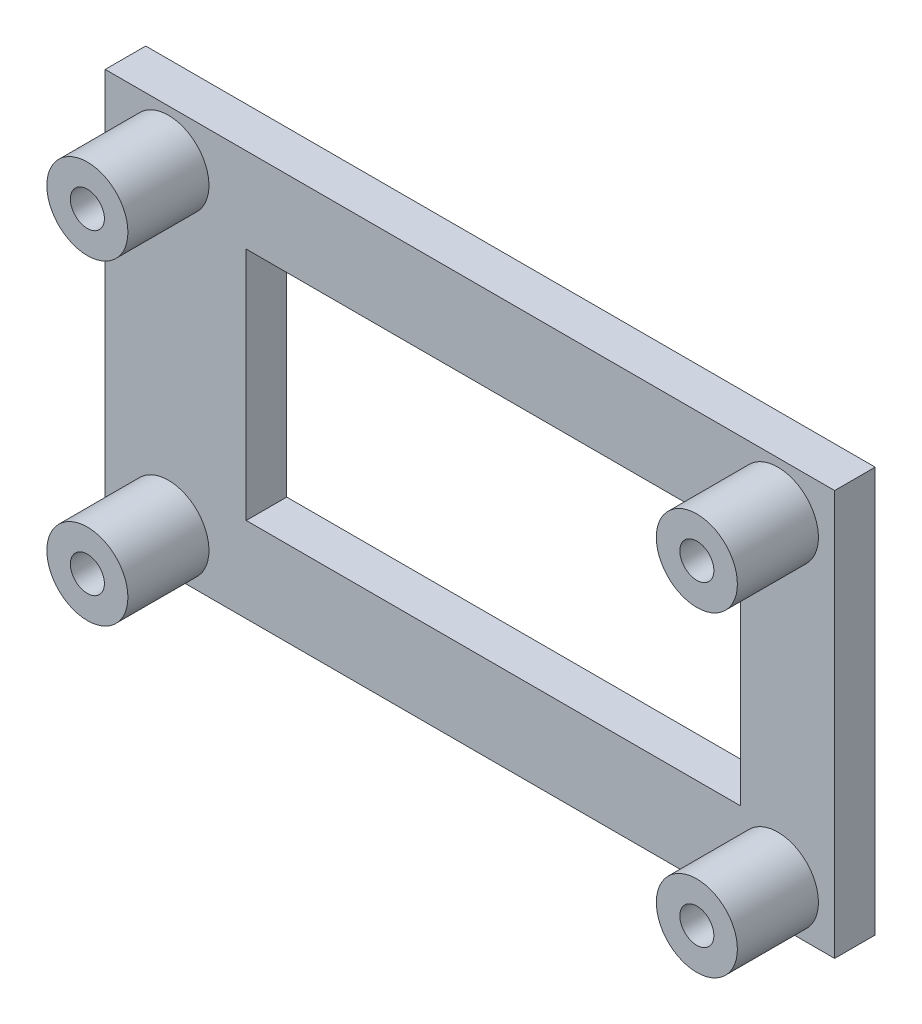
ISO-10303-21;
HEADER;
FILE_DESCRIPTION(('STEP AP214'),'2;1');
FILE_NAME('part.step','',(''),(''),'','','');
FILE_SCHEMA(('AUTOMOTIVE_DESIGN { 1 0 10303 214 1 1 1 1 }'));
ENDSEC;
DATA;
#1=APPLICATION_CONTEXT('core data for automotive mechanical design processes');
#2=APPLICATION_PROTOCOL_DEFINITION('international standard','automotive_design',2000,#1);
#3=PRODUCT_CONTEXT('',#1,'mechanical');
#4=PRODUCT('Part','Part','',(#3));
#5=PRODUCT_RELATED_PRODUCT_CATEGORY('part','',(#4));
#6=PRODUCT_DEFINITION_FORMATION('','',#4);
#7=PRODUCT_DEFINITION_CONTEXT('part definition',#1,'design');
#8=PRODUCT_DEFINITION('design','',#6,#7);
#9=PRODUCT_DEFINITION_SHAPE('','',#8);
#10=(LENGTH_UNIT() NAMED_UNIT(*) SI_UNIT(.MILLI.,.METRE.));
#11=(NAMED_UNIT(*) PLANE_ANGLE_UNIT() SI_UNIT($,.RADIAN.));
#12=(NAMED_UNIT(*) SI_UNIT($,.STERADIAN.) SOLID_ANGLE_UNIT());
#13=UNCERTAINTY_MEASURE_WITH_UNIT(LENGTH_MEASURE(1.E-05),#10,'distance_accuracy_value','');
#14=(GEOMETRIC_REPRESENTATION_CONTEXT(3) GLOBAL_UNCERTAINTY_ASSIGNED_CONTEXT((#13)) GLOBAL_UNIT_ASSIGNED_CONTEXT((#10,
#11,#12)) REPRESENTATION_CONTEXT('',''));
#15=CARTESIAN_POINT('',(0.,0.,0.));
#16=DIRECTION('',(0.,0.,1.));
#17=DIRECTION('',(1.,0.,0.));
#18=AXIS2_PLACEMENT_3D('',#15,#16,#17);
#19=CARTESIAN_POINT('',(0.,0.,-2.5));
#20=DIRECTION('',(1.,0.,0.));
#21=DIRECTION('',(0.,0.,-1.));
#22=AXIS2_PLACEMENT_3D('',#19,#20,#21);
#23=PLANE('',#22);
#24=DIRECTION('',(0.,1.,0.));
#25=VECTOR('',#24,1.);
#26=CARTESIAN_POINT('',(0.,0.,0.));
#27=LINE('',#26,#25);
#28=CARTESIAN_POINT('',(0.,0.,0.));
#29=VERTEX_POINT('',#28);
#30=CARTESIAN_POINT('',(0.,25.,0.));
#31=VERTEX_POINT('',#30);
#32=EDGE_CURVE('E188',#29,#31,#27,.T.);
#33=ORIENTED_EDGE('',*,*,#32,.T.);
#34=DIRECTION('',(0.,0.,1.));
#35=VECTOR('',#34,1.);
#36=CARTESIAN_POINT('',(0.,25.,-2.5));
#37=LINE('',#36,#35);
#38=CARTESIAN_POINT('',(0.,25.,-2.5));
#39=VERTEX_POINT('',#38);
#40=EDGE_CURVE('E219',#39,#31,#37,.T.);
#41=ORIENTED_EDGE('',*,*,#40,.F.);
#42=DIRECTION('',(0.,1.,0.));
#43=VECTOR('',#42,1.);
#44=CARTESIAN_POINT('',(0.,0.,-2.5));
#45=LINE('',#44,#43);
#46=CARTESIAN_POINT('',(0.,0.,-2.5));
#47=VERTEX_POINT('',#46);
#48=EDGE_CURVE('E189',#47,#39,#45,.T.);
#49=ORIENTED_EDGE('',*,*,#48,.F.);
#50=DIRECTION('',(0.,0.,1.));
#51=VECTOR('',#50,1.);
#52=CARTESIAN_POINT('',(0.,0.,-2.5));
#53=LINE('',#52,#51);
#54=EDGE_CURVE('E201',#47,#29,#53,.T.);
#55=ORIENTED_EDGE('',*,*,#54,.T.);
#56=EDGE_LOOP('',(#33,#41,#49,#55));
#57=FACE_BOUND('',#56,.T.);
#58=ADVANCED_FACE('F39',(#57),#23,.F.);
#59=CARTESIAN_POINT('',(0.,25.,-2.5));
#60=DIRECTION('',(0.,-1.,0.));
#61=DIRECTION('',(0.,0.,-1.));
#62=AXIS2_PLACEMENT_3D('',#59,#60,#61);
#63=PLANE('',#62);
#64=DIRECTION('',(1.,0.,0.));
#65=VECTOR('',#64,1.);
#66=CARTESIAN_POINT('',(0.,25.,0.));
#67=LINE('',#66,#65);
#68=CARTESIAN_POINT('',(45.,25.,0.));
#69=VERTEX_POINT('',#68);
#70=EDGE_CURVE('E204',#31,#69,#67,.T.);
#71=ORIENTED_EDGE('',*,*,#70,.T.);
#72=DIRECTION('',(0.,0.,1.));
#73=VECTOR('',#72,1.);
#74=CARTESIAN_POINT('',(45.,25.,-2.5));
#75=LINE('',#74,#73);
#76=CARTESIAN_POINT('',(45.,25.,-2.5));
#77=VERTEX_POINT('',#76);
#78=EDGE_CURVE('E217',#77,#69,#75,.T.);
#79=ORIENTED_EDGE('',*,*,#78,.F.);
#80=DIRECTION('',(1.,0.,0.));
#81=VECTOR('',#80,1.);
#82=CARTESIAN_POINT('',(0.,25.,-2.5));
#83=LINE('',#82,#81);
#84=EDGE_CURVE('E192',#39,#77,#83,.T.);
#85=ORIENTED_EDGE('',*,*,#84,.F.);
#86=ORIENTED_EDGE('',*,*,#40,.T.);
#87=EDGE_LOOP('',(#71,#79,#85,#86));
#88=FACE_BOUND('',#87,.T.);
#89=ADVANCED_FACE('F245',(#88),#63,.F.);
#90=CARTESIAN_POINT('',(45.,0.,-2.5));
#91=DIRECTION('',(1.,0.,0.));
#92=DIRECTION('',(0.,0.,-1.));
#93=AXIS2_PLACEMENT_3D('',#90,#91,#92);
#94=PLANE('',#93);
#95=DIRECTION('',(0.,1.,0.));
#96=VECTOR('',#95,1.);
#97=CARTESIAN_POINT('',(45.,0.,0.));
#98=LINE('',#97,#96);
#99=CARTESIAN_POINT('',(45.,0.,0.));
#100=VERTEX_POINT('',#99);
#101=EDGE_CURVE('E207',#100,#69,#98,.T.);
#102=ORIENTED_EDGE('',*,*,#101,.F.);
#103=DIRECTION('',(0.,0.,1.));
#104=VECTOR('',#103,1.);
#105=CARTESIAN_POINT('',(45.,0.,-2.5));
#106=LINE('',#105,#104);
#107=CARTESIAN_POINT('',(45.,0.,-2.5));
#108=VERTEX_POINT('',#107);
#109=EDGE_CURVE('E214',#108,#100,#106,.T.);
#110=ORIENTED_EDGE('',*,*,#109,.F.);
#111=DIRECTION('',(0.,1.,0.));
#112=VECTOR('',#111,1.);
#113=CARTESIAN_POINT('',(45.,0.,-2.5));
#114=LINE('',#113,#112);
#115=EDGE_CURVE('E195',#108,#77,#114,.T.);
#116=ORIENTED_EDGE('',*,*,#115,.T.);
#117=ORIENTED_EDGE('',*,*,#78,.T.);
#118=EDGE_LOOP('',(#102,#110,#116,#117));
#119=FACE_BOUND('',#118,.T.);
#120=ADVANCED_FACE('F241',(#119),#94,.T.);
#121=CARTESIAN_POINT('',(0.,0.,-2.5));
#122=DIRECTION('',(0.,-1.,0.));
#123=DIRECTION('',(0.,0.,-1.));
#124=AXIS2_PLACEMENT_3D('',#121,#122,#123);
#125=PLANE('',#124);
#126=DIRECTION('',(1.,0.,0.));
#127=VECTOR('',#126,1.);
#128=CARTESIAN_POINT('',(0.,0.,0.));
#129=LINE('',#128,#127);
#130=CARTESIAN_POINT('',(3.9,0.,0.));
#131=VERTEX_POINT('',#130);
#132=EDGE_CURVE('E193',#29,#131,#129,.T.);
#133=ORIENTED_EDGE('',*,*,#132,.F.);
#134=ORIENTED_EDGE('',*,*,#54,.F.);
#135=DIRECTION('',(1.,0.,0.));
#136=VECTOR('',#135,1.);
#137=CARTESIAN_POINT('',(0.,0.,-2.5));
#138=LINE('',#137,#136);
#139=EDGE_CURVE('E198',#47,#108,#138,.T.);
#140=ORIENTED_EDGE('',*,*,#139,.T.);
#141=ORIENTED_EDGE('',*,*,#109,.T.);
#142=CARTESIAN_POINT('',(41.5,0.,0.));
#143=VERTEX_POINT('',#142);
#144=EDGE_CURVE('E210',#143,#100,#129,.T.);
#145=ORIENTED_EDGE('',*,*,#144,.F.);
#146=EDGE_CURVE('E212',#131,#143,#129,.T.);
#147=ORIENTED_EDGE('',*,*,#146,.F.);
#148=EDGE_LOOP('',(#133,#134,#140,#141,#145,#147));
#149=FACE_BOUND('',#148,.T.);
#150=ADVANCED_FACE('F237',(#149),#125,.T.);
#151=CARTESIAN_POINT('',(0.,0.,-2.5));
#152=DIRECTION('',(0.,0.,-1.));
#153=DIRECTION('',(-1.,0.,0.));
#154=AXIS2_PLACEMENT_3D('',#151,#152,#153);
#155=PLANE('',#154);
#156=DIRECTION('',(0.,-1.,0.));
#157=VECTOR('',#156,1.);
#158=CARTESIAN_POINT('',(8.7,19.75,-2.5));
#159=LINE('',#158,#157);
#160=CARTESIAN_POINT('',(8.7,19.75,-2.5));
#161=VERTEX_POINT('',#160);
#162=CARTESIAN_POINT('',(8.7,5.25,-2.5));
#163=VERTEX_POINT('',#162);
#164=EDGE_CURVE('E123',#161,#163,#159,.T.);
#165=ORIENTED_EDGE('',*,*,#164,.T.);
#166=DIRECTION('',(1.,0.,0.));
#167=VECTOR('',#166,1.);
#168=CARTESIAN_POINT('',(8.7,5.25,-2.5));
#169=LINE('',#168,#167);
#170=CARTESIAN_POINT('',(39.2,5.25,-2.5));
#171=VERTEX_POINT('',#170);
#172=EDGE_CURVE('E110',#163,#171,#169,.T.);
#173=ORIENTED_EDGE('',*,*,#172,.T.);
#174=DIRECTION('',(0.,-1.,0.));
#175=VECTOR('',#174,1.);
#176=CARTESIAN_POINT('',(39.2,19.75,-2.5));
#177=LINE('',#176,#175);
#178=CARTESIAN_POINT('',(39.2,19.75,-2.5));
#179=VERTEX_POINT('',#178);
#180=EDGE_CURVE('E140',#179,#171,#177,.T.);
#181=ORIENTED_EDGE('',*,*,#180,.F.);
#182=DIRECTION('',(1.,0.,0.));
#183=VECTOR('',#182,1.);
#184=CARTESIAN_POINT('',(8.7,19.75,-2.5));
#185=LINE('',#184,#183);
#186=EDGE_CURVE('E131',#161,#179,#185,.T.);
#187=ORIENTED_EDGE('',*,*,#186,.F.);
#188=EDGE_LOOP('',(#165,#173,#181,#187));
#189=FACE_BOUND('',#188,.T.);
#190=ORIENTED_EDGE('',*,*,#48,.T.);
#191=ORIENTED_EDGE('',*,*,#84,.T.);
#192=ORIENTED_EDGE('',*,*,#115,.F.);
#193=ORIENTED_EDGE('',*,*,#139,.F.);
#194=EDGE_LOOP('',(#190,#191,#192,#193));
#195=FACE_BOUND('',#194,.T.);
#196=ADVANCED_FACE('F129',(#189,#195),#155,.T.);
#197=CARTESIAN_POINT('',(0.,0.,0.));
#198=DIRECTION('',(0.,0.,-1.));
#199=DIRECTION('',(-1.,0.,0.));
#200=AXIS2_PLACEMENT_3D('',#197,#198,#199);
#201=PLANE('',#200);
#202=DIRECTION('',(1.,0.,0.));
#203=VECTOR('',#202,1.);
#204=CARTESIAN_POINT('',(8.7,5.25,0.));
#205=LINE('',#204,#203);
#206=CARTESIAN_POINT('',(8.7,5.25,0.));
#207=VERTEX_POINT('',#206);
#208=CARTESIAN_POINT('',(39.2,5.25,0.));
#209=VERTEX_POINT('',#208);
#210=EDGE_CURVE('E132',#207,#209,#205,.T.);
#211=ORIENTED_EDGE('',*,*,#210,.F.);
#212=DIRECTION('',(0.,-1.,0.));
#213=VECTOR('',#212,1.);
#214=CARTESIAN_POINT('',(8.7,19.75,0.));
#215=LINE('',#214,#213);
#216=CARTESIAN_POINT('',(8.7,19.75,0.));
#217=VERTEX_POINT('',#216);
#218=EDGE_CURVE('E126',#217,#207,#215,.T.);
#219=ORIENTED_EDGE('',*,*,#218,.F.);
#220=DIRECTION('',(1.,0.,0.));
#221=VECTOR('',#220,1.);
#222=CARTESIAN_POINT('',(8.7,19.75,0.));
#223=LINE('',#222,#221);
#224=CARTESIAN_POINT('',(39.2,19.75,0.));
#225=VERTEX_POINT('',#224);
#226=EDGE_CURVE('E137',#217,#225,#223,.T.);
#227=ORIENTED_EDGE('',*,*,#226,.T.);
#228=DIRECTION('',(0.,-1.,0.));
#229=VECTOR('',#228,1.);
#230=CARTESIAN_POINT('',(39.2,19.75,0.));
#231=LINE('',#230,#229);
#232=EDGE_CURVE('E61',#225,#209,#231,.T.);
#233=ORIENTED_EDGE('',*,*,#232,.T.);
#234=EDGE_LOOP('',(#211,#219,#227,#233));
#235=FACE_BOUND('',#234,.T.);
#236=CARTESIAN_POINT('',(41.5,22.,0.));
#237=DIRECTION('',(0.,0.,-1.));
#238=DIRECTION('',(-1.,0.,0.));
#239=AXIS2_PLACEMENT_3D('',#236,#237,#238);
#240=CIRCLE('',#239,2.5);
#241=CARTESIAN_POINT('',(39.,22.,0.));
#242=VERTEX_POINT('',#241);
#243=EDGE_CURVE('E11',#242,#242,#240,.F.);
#244=ORIENTED_EDGE('',*,*,#243,.F.);
#245=EDGE_LOOP('',(#244));
#246=FACE_BOUND('',#245,.T.);
#247=CARTESIAN_POINT('',(3.9,22.,0.));
#248=DIRECTION('',(0.,0.,-1.));
#249=DIRECTION('',(-1.,0.,0.));
#250=AXIS2_PLACEMENT_3D('',#247,#248,#249);
#251=CIRCLE('',#250,2.5);
#252=CARTESIAN_POINT('',(1.4,22.,0.));
#253=VERTEX_POINT('',#252);
#254=EDGE_CURVE('E46',#253,#253,#251,.F.);
#255=ORIENTED_EDGE('',*,*,#254,.F.);
#256=EDGE_LOOP('',(#255));
#257=FACE_BOUND('',#256,.T.);
#258=ORIENTED_EDGE('',*,*,#146,.T.);
#259=CARTESIAN_POINT('',(41.5,2.5,0.));
#260=DIRECTION('',(0.,0.,1.));
#261=DIRECTION('',(1.,0.,0.));
#262=AXIS2_PLACEMENT_3D('',#259,#260,#261);
#263=CIRCLE('',#262,2.5);
#264=EDGE_CURVE('E173',#143,#143,#263,.T.);
#265=ORIENTED_EDGE('',*,*,#264,.F.);
#266=ORIENTED_EDGE('',*,*,#144,.T.);
#267=ORIENTED_EDGE('',*,*,#101,.T.);
#268=ORIENTED_EDGE('',*,*,#70,.F.);
#269=ORIENTED_EDGE('',*,*,#32,.F.);
#270=ORIENTED_EDGE('',*,*,#132,.T.);
#271=CARTESIAN_POINT('',(3.9,2.5,0.));
#272=DIRECTION('',(0.,0.,1.));
#273=DIRECTION('',(1.,0.,0.));
#274=AXIS2_PLACEMENT_3D('',#271,#272,#273);
#275=CIRCLE('',#274,2.5);
#276=EDGE_CURVE('E177',#131,#131,#275,.T.);
#277=ORIENTED_EDGE('',*,*,#276,.F.);
#278=EDGE_LOOP('',(#258,#265,#266,#267,#268,#269,#270,#277));
#279=FACE_BOUND('',#278,.T.);
#280=ADVANCED_FACE('F226',(#235,#246,#257,#279),#201,.F.);
#281=CARTESIAN_POINT('',(3.9,22.,5.));
#282=DIRECTION('',(0.,0.,-1.));
#283=DIRECTION('',(-1.,0.,0.));
#284=AXIS2_PLACEMENT_3D('',#281,#282,#283);
#285=CYLINDRICAL_SURFACE('',#284,2.5);
#286=CARTESIAN_POINT('',(3.9,22.,5.));
#287=DIRECTION('',(0.,0.,1.));
#288=DIRECTION('',(1.,0.,0.));
#289=AXIS2_PLACEMENT_3D('',#286,#287,#288);
#290=CIRCLE('',#289,2.5);
#291=CARTESIAN_POINT('',(6.4,22.,5.));
#292=VERTEX_POINT('',#291);
#293=EDGE_CURVE('E183',#292,#292,#290,.T.);
#294=ORIENTED_EDGE('',*,*,#293,.F.);
#295=EDGE_LOOP('',(#294));
#296=FACE_BOUND('',#295,.T.);
#297=ORIENTED_EDGE('',*,*,#254,.T.);
#298=EDGE_LOOP('',(#297));
#299=FACE_BOUND('',#298,.T.);
#300=ADVANCED_FACE('F224',(#296,#299),#285,.T.);
#301=CARTESIAN_POINT('',(0.,0.,5.));
#302=DIRECTION('',(0.,0.,1.));
#303=DIRECTION('',(1.,0.,0.));
#304=AXIS2_PLACEMENT_3D('',#301,#302,#303);
#305=PLANE('',#304);
#306=CARTESIAN_POINT('',(3.9,22.,5.));
#307=DIRECTION('',(0.,0.,1.));
#308=DIRECTION('',(1.,0.,0.));
#309=AXIS2_PLACEMENT_3D('',#306,#307,#308);
#310=CIRCLE('',#309,1.05);
#311=CARTESIAN_POINT('',(4.95,22.,5.));
#312=VERTEX_POINT('',#311);
#313=EDGE_CURVE('E156',#312,#312,#310,.T.);
#314=ORIENTED_EDGE('',*,*,#313,.F.);
#315=EDGE_LOOP('',(#314));
#316=FACE_BOUND('',#315,.T.);
#317=ORIENTED_EDGE('',*,*,#293,.T.);
#318=EDGE_LOOP('',(#317));
#319=FACE_BOUND('',#318,.T.);
#320=ADVANCED_FACE('F281',(#316,#319),#305,.T.);
#321=CARTESIAN_POINT('',(3.9,2.5,5.));
#322=DIRECTION('',(0.,0.,-1.));
#323=DIRECTION('',(-1.,0.,0.));
#324=AXIS2_PLACEMENT_3D('',#321,#322,#323);
#325=CYLINDRICAL_SURFACE('',#324,2.5);
#326=CARTESIAN_POINT('',(3.9,2.5,5.));
#327=DIRECTION('',(0.,0.,1.));
#328=DIRECTION('',(1.,0.,0.));
#329=AXIS2_PLACEMENT_3D('',#326,#327,#328);
#330=CIRCLE('',#329,2.5);
#331=CARTESIAN_POINT('',(6.4,2.5,5.));
#332=VERTEX_POINT('',#331);
#333=EDGE_CURVE('E180',#332,#332,#330,.T.);
#334=ORIENTED_EDGE('',*,*,#333,.F.);
#335=EDGE_LOOP('',(#334));
#336=FACE_BOUND('',#335,.T.);
#337=ORIENTED_EDGE('',*,*,#276,.T.);
#338=EDGE_LOOP('',(#337));
#339=FACE_BOUND('',#338,.T.);
#340=ADVANCED_FACE('F289',(#336,#339),#325,.T.);
#341=CARTESIAN_POINT('',(0.,0.,5.));
#342=DIRECTION('',(0.,0.,1.));
#343=DIRECTION('',(1.,0.,0.));
#344=AXIS2_PLACEMENT_3D('',#341,#342,#343);
#345=PLANE('',#344);
#346=CARTESIAN_POINT('',(3.9,2.5,5.));
#347=DIRECTION('',(0.,0.,1.));
#348=DIRECTION('',(1.,0.,0.));
#349=AXIS2_PLACEMENT_3D('',#346,#347,#348);
#350=CIRCLE('',#349,1.05);
#351=CARTESIAN_POINT('',(4.95,2.5,5.));
#352=VERTEX_POINT('',#351);
#353=EDGE_CURVE('E157',#352,#352,#350,.T.);
#354=ORIENTED_EDGE('',*,*,#353,.F.);
#355=EDGE_LOOP('',(#354));
#356=FACE_BOUND('',#355,.T.);
#357=ORIENTED_EDGE('',*,*,#333,.T.);
#358=EDGE_LOOP('',(#357));
#359=FACE_BOUND('',#358,.T.);
#360=ADVANCED_FACE('F294',(#356,#359),#345,.T.);
#361=CARTESIAN_POINT('',(41.5,2.5,5.));
#362=DIRECTION('',(0.,0.,-1.));
#363=DIRECTION('',(-1.,0.,0.));
#364=AXIS2_PLACEMENT_3D('',#361,#362,#363);
#365=CYLINDRICAL_SURFACE('',#364,2.5);
#366=CARTESIAN_POINT('',(41.5,2.5,5.));
#367=DIRECTION('',(0.,0.,1.));
#368=DIRECTION('',(1.,0.,0.));
#369=AXIS2_PLACEMENT_3D('',#366,#367,#368);
#370=CIRCLE('',#369,2.5);
#371=CARTESIAN_POINT('',(44.,2.5,5.));
#372=VERTEX_POINT('',#371);
#373=EDGE_CURVE('E174',#372,#372,#370,.T.);
#374=ORIENTED_EDGE('',*,*,#373,.F.);
#375=EDGE_LOOP('',(#374));
#376=FACE_BOUND('',#375,.T.);
#377=ORIENTED_EDGE('',*,*,#264,.T.);
#378=EDGE_LOOP('',(#377));
#379=FACE_BOUND('',#378,.T.);
#380=ADVANCED_FACE('F302',(#376,#379),#365,.T.);
#381=CARTESIAN_POINT('',(0.,0.,5.));
#382=DIRECTION('',(0.,0.,1.));
#383=DIRECTION('',(1.,0.,0.));
#384=AXIS2_PLACEMENT_3D('',#381,#382,#383);
#385=PLANE('',#384);
#386=CARTESIAN_POINT('',(41.5,2.5,5.));
#387=DIRECTION('',(0.,0.,1.));
#388=DIRECTION('',(1.,0.,0.));
#389=AXIS2_PLACEMENT_3D('',#386,#387,#388);
#390=CIRCLE('',#389,1.05);
#391=CARTESIAN_POINT('',(42.55,2.5,5.));
#392=VERTEX_POINT('',#391);
#393=EDGE_CURVE('E150',#392,#392,#390,.T.);
#394=ORIENTED_EDGE('',*,*,#393,.F.);
#395=EDGE_LOOP('',(#394));
#396=FACE_BOUND('',#395,.T.);
#397=ORIENTED_EDGE('',*,*,#373,.T.);
#398=EDGE_LOOP('',(#397));
#399=FACE_BOUND('',#398,.T.);
#400=ADVANCED_FACE('F307',(#396,#399),#385,.T.);
#401=CARTESIAN_POINT('',(41.5,22.,5.));
#402=DIRECTION('',(0.,0.,-1.));
#403=DIRECTION('',(-1.,0.,0.));
#404=AXIS2_PLACEMENT_3D('',#401,#402,#403);
#405=CYLINDRICAL_SURFACE('',#404,2.5);
#406=CARTESIAN_POINT('',(41.5,22.,5.));
#407=DIRECTION('',(0.,0.,1.));
#408=DIRECTION('',(1.,0.,0.));
#409=AXIS2_PLACEMENT_3D('',#406,#407,#408);
#410=CIRCLE('',#409,2.5);
#411=CARTESIAN_POINT('',(44.,22.,5.));
#412=VERTEX_POINT('',#411);
#413=EDGE_CURVE('E168',#412,#412,#410,.T.);
#414=ORIENTED_EDGE('',*,*,#413,.F.);
#415=EDGE_LOOP('',(#414));
#416=FACE_BOUND('',#415,.T.);
#417=ORIENTED_EDGE('',*,*,#243,.T.);
#418=EDGE_LOOP('',(#417));
#419=FACE_BOUND('',#418,.T.);
#420=ADVANCED_FACE('F315',(#416,#419),#405,.T.);
#421=CARTESIAN_POINT('',(0.,0.,5.));
#422=DIRECTION('',(0.,0.,1.));
#423=DIRECTION('',(1.,0.,0.));
#424=AXIS2_PLACEMENT_3D('',#421,#422,#423);
#425=PLANE('',#424);
#426=CARTESIAN_POINT('',(41.5,22.,5.));
#427=DIRECTION('',(0.,0.,1.));
#428=DIRECTION('',(1.,0.,0.));
#429=AXIS2_PLACEMENT_3D('',#426,#427,#428);
#430=CIRCLE('',#429,1.05);
#431=CARTESIAN_POINT('',(42.55,22.,5.));
#432=VERTEX_POINT('',#431);
#433=EDGE_CURVE('E149',#432,#432,#430,.T.);
#434=ORIENTED_EDGE('',*,*,#433,.F.);
#435=EDGE_LOOP('',(#434));
#436=FACE_BOUND('',#435,.T.);
#437=ORIENTED_EDGE('',*,*,#413,.T.);
#438=EDGE_LOOP('',(#437));
#439=FACE_BOUND('',#438,.T.);
#440=ADVANCED_FACE('F320',(#436,#439),#425,.T.);
#441=CARTESIAN_POINT('',(41.5,22.,0.));
#442=DIRECTION('',(0.,0.,1.));
#443=DIRECTION('',(1.,0.,0.));
#444=AXIS2_PLACEMENT_3D('',#441,#442,#443);
#445=CYLINDRICAL_SURFACE('',#444,1.05);
#446=CARTESIAN_POINT('',(41.5,22.,0.));
#447=DIRECTION('',(0.,0.,1.));
#448=DIRECTION('',(1.,0.,0.));
#449=AXIS2_PLACEMENT_3D('',#446,#447,#448);
#450=CIRCLE('',#449,1.05);
#451=CARTESIAN_POINT('',(42.55,22.,0.));
#452=VERTEX_POINT('',#451);
#453=EDGE_CURVE('E160',#452,#452,#450,.T.);
#454=ORIENTED_EDGE('',*,*,#453,.F.);
#455=EDGE_LOOP('',(#454));
#456=FACE_BOUND('',#455,.T.);
#457=ORIENTED_EDGE('',*,*,#433,.T.);
#458=EDGE_LOOP('',(#457));
#459=FACE_BOUND('',#458,.T.);
#460=ADVANCED_FACE('F351',(#456,#459),#445,.F.);
#461=CARTESIAN_POINT('',(41.5,22.,0.));
#462=DIRECTION('',(0.,0.,1.));
#463=DIRECTION('',(1.,0.,0.));
#464=AXIS2_PLACEMENT_3D('',#461,#462,#463);
#465=PLANE('',#464);
#466=ORIENTED_EDGE('',*,*,#453,.T.);
#467=EDGE_LOOP('',(#466));
#468=FACE_BOUND('',#467,.T.);
#469=ADVANCED_FACE('F361',(#468),#465,.T.);
#470=CARTESIAN_POINT('',(41.5,2.5,0.));
#471=DIRECTION('',(0.,0.,1.));
#472=DIRECTION('',(1.,0.,0.));
#473=AXIS2_PLACEMENT_3D('',#470,#471,#472);
#474=CYLINDRICAL_SURFACE('',#473,1.05);
#475=CARTESIAN_POINT('',(41.5,2.5,0.));
#476=DIRECTION('',(0.,0.,1.));
#477=DIRECTION('',(1.,0.,0.));
#478=AXIS2_PLACEMENT_3D('',#475,#476,#477);
#479=CIRCLE('',#478,1.05);
#480=CARTESIAN_POINT('',(42.55,2.5,0.));
#481=VERTEX_POINT('',#480);
#482=EDGE_CURVE('E146',#481,#481,#479,.T.);
#483=ORIENTED_EDGE('',*,*,#482,.F.);
#484=EDGE_LOOP('',(#483));
#485=FACE_BOUND('',#484,.T.);
#486=ORIENTED_EDGE('',*,*,#393,.T.);
#487=EDGE_LOOP('',(#486));
#488=FACE_BOUND('',#487,.T.);
#489=ADVANCED_FACE('F371',(#485,#488),#474,.F.);
#490=CARTESIAN_POINT('',(41.5,2.5,0.));
#491=DIRECTION('',(0.,0.,1.));
#492=DIRECTION('',(1.,0.,0.));
#493=AXIS2_PLACEMENT_3D('',#490,#491,#492);
#494=PLANE('',#493);
#495=ORIENTED_EDGE('',*,*,#482,.T.);
#496=EDGE_LOOP('',(#495));
#497=FACE_BOUND('',#496,.T.);
#498=ADVANCED_FACE('F381',(#497),#494,.T.);
#499=CARTESIAN_POINT('',(3.9,2.5,0.));
#500=DIRECTION('',(0.,0.,1.));
#501=DIRECTION('',(1.,0.,0.));
#502=AXIS2_PLACEMENT_3D('',#499,#500,#501);
#503=CYLINDRICAL_SURFACE('',#502,1.05);
#504=CARTESIAN_POINT('',(3.9,2.5,0.));
#505=DIRECTION('',(0.,0.,1.));
#506=DIRECTION('',(1.,0.,0.));
#507=AXIS2_PLACEMENT_3D('',#504,#505,#506);
#508=CIRCLE('',#507,1.05);
#509=CARTESIAN_POINT('',(4.95,2.5,0.));
#510=VERTEX_POINT('',#509);
#511=EDGE_CURVE('E153',#510,#510,#508,.T.);
#512=ORIENTED_EDGE('',*,*,#511,.F.);
#513=EDGE_LOOP('',(#512));
#514=FACE_BOUND('',#513,.T.);
#515=ORIENTED_EDGE('',*,*,#353,.T.);
#516=EDGE_LOOP('',(#515));
#517=FACE_BOUND('',#516,.T.);
#518=ADVANCED_FACE('F391',(#514,#517),#503,.F.);
#519=CARTESIAN_POINT('',(3.9,2.5,0.));
#520=DIRECTION('',(0.,0.,1.));
#521=DIRECTION('',(1.,0.,0.));
#522=AXIS2_PLACEMENT_3D('',#519,#520,#521);
#523=PLANE('',#522);
#524=ORIENTED_EDGE('',*,*,#511,.T.);
#525=EDGE_LOOP('',(#524));
#526=FACE_BOUND('',#525,.T.);
#527=ADVANCED_FACE('F401',(#526),#523,.T.);
#528=CARTESIAN_POINT('',(3.9,22.,0.));
#529=DIRECTION('',(0.,0.,1.));
#530=DIRECTION('',(1.,0.,0.));
#531=AXIS2_PLACEMENT_3D('',#528,#529,#530);
#532=CYLINDRICAL_SURFACE('',#531,1.05);
#533=CARTESIAN_POINT('',(3.9,22.,0.));
#534=DIRECTION('',(0.,0.,1.));
#535=DIRECTION('',(1.,0.,0.));
#536=AXIS2_PLACEMENT_3D('',#533,#534,#535);
#537=CIRCLE('',#536,1.05);
#538=CARTESIAN_POINT('',(4.95,22.,0.));
#539=VERTEX_POINT('',#538);
#540=EDGE_CURVE('E165',#539,#539,#537,.T.);
#541=ORIENTED_EDGE('',*,*,#540,.F.);
#542=EDGE_LOOP('',(#541));
#543=FACE_BOUND('',#542,.T.);
#544=ORIENTED_EDGE('',*,*,#313,.T.);
#545=EDGE_LOOP('',(#544));
#546=FACE_BOUND('',#545,.T.);
#547=ADVANCED_FACE('F411',(#543,#546),#532,.F.);
#548=CARTESIAN_POINT('',(3.9,22.,0.));
#549=DIRECTION('',(0.,0.,1.));
#550=DIRECTION('',(1.,0.,0.));
#551=AXIS2_PLACEMENT_3D('',#548,#549,#550);
#552=PLANE('',#551);
#553=ORIENTED_EDGE('',*,*,#540,.T.);
#554=EDGE_LOOP('',(#553));
#555=FACE_BOUND('',#554,.T.);
#556=ADVANCED_FACE('F421',(#555),#552,.T.);
#557=CARTESIAN_POINT('',(8.7,19.75,-36.2712895815366));
#558=DIRECTION('',(-1.,0.,0.));
#559=DIRECTION('',(0.,-1.,0.));
#560=AXIS2_PLACEMENT_3D('',#557,#558,#559);
#561=PLANE('',#560);
#562=DIRECTION('',(0.,0.,1.));
#563=VECTOR('',#562,1.);
#564=CARTESIAN_POINT('',(8.7,19.75,-36.2712895815366));
#565=LINE('',#564,#563);
#566=EDGE_CURVE('E53',#161,#217,#565,.T.);
#567=ORIENTED_EDGE('',*,*,#566,.T.);
#568=ORIENTED_EDGE('',*,*,#218,.T.);
#569=DIRECTION('',(0.,0.,1.));
#570=VECTOR('',#569,1.);
#571=CARTESIAN_POINT('',(8.7,5.25,-36.2712895815366));
#572=LINE('',#571,#570);
#573=EDGE_CURVE('E114',#163,#207,#572,.T.);
#574=ORIENTED_EDGE('',*,*,#573,.F.);
#575=ORIENTED_EDGE('',*,*,#164,.F.);
#576=EDGE_LOOP('',(#567,#568,#574,#575));
#577=FACE_BOUND('',#576,.T.);
#578=ADVANCED_FACE('F122',(#577),#561,.F.);
#579=CARTESIAN_POINT('',(8.7,5.25,-36.2712895815366));
#580=DIRECTION('',(0.,-1.,0.));
#581=DIRECTION('',(0.,0.,-1.));
#582=AXIS2_PLACEMENT_3D('',#579,#580,#581);
#583=PLANE('',#582);
#584=ORIENTED_EDGE('',*,*,#573,.T.);
#585=ORIENTED_EDGE('',*,*,#210,.T.);
#586=DIRECTION('',(0.,0.,1.));
#587=VECTOR('',#586,1.);
#588=CARTESIAN_POINT('',(39.2,5.25,-36.2712895815366));
#589=LINE('',#588,#587);
#590=EDGE_CURVE('E116',#171,#209,#589,.T.);
#591=ORIENTED_EDGE('',*,*,#590,.F.);
#592=ORIENTED_EDGE('',*,*,#172,.F.);
#593=EDGE_LOOP('',(#584,#585,#591,#592));
#594=FACE_BOUND('',#593,.T.);
#595=ADVANCED_FACE('F112',(#594),#583,.F.);
#596=CARTESIAN_POINT('',(39.2,19.75,-36.2712895815366));
#597=DIRECTION('',(-1.,0.,0.));
#598=DIRECTION('',(0.,-1.,0.));
#599=AXIS2_PLACEMENT_3D('',#596,#597,#598);
#600=PLANE('',#599);
#601=ORIENTED_EDGE('',*,*,#180,.T.);
#602=ORIENTED_EDGE('',*,*,#590,.T.);
#603=ORIENTED_EDGE('',*,*,#232,.F.);
#604=DIRECTION('',(0.,0.,1.));
#605=VECTOR('',#604,1.);
#606=CARTESIAN_POINT('',(39.2,19.75,-36.2712895815366));
#607=LINE('',#606,#605);
#608=EDGE_CURVE('E142',#179,#225,#607,.T.);
#609=ORIENTED_EDGE('',*,*,#608,.F.);
#610=EDGE_LOOP('',(#601,#602,#603,#609));
#611=FACE_BOUND('',#610,.T.);
#612=ADVANCED_FACE('F456',(#611),#600,.T.);
#613=CARTESIAN_POINT('',(8.7,19.75,-36.2712895815366));
#614=DIRECTION('',(0.,-1.,0.));
#615=DIRECTION('',(0.,0.,-1.));
#616=AXIS2_PLACEMENT_3D('',#613,#614,#615);
#617=PLANE('',#616);
#618=ORIENTED_EDGE('',*,*,#186,.T.);
#619=ORIENTED_EDGE('',*,*,#608,.T.);
#620=ORIENTED_EDGE('',*,*,#226,.F.);
#621=ORIENTED_EDGE('',*,*,#566,.F.);
#622=EDGE_LOOP('',(#618,#619,#620,#621));
#623=FACE_BOUND('',#622,.T.);
#624=ADVANCED_FACE('F465',(#623),#617,.T.);
#625=CLOSED_SHELL('',(#58,#89,#120,#150,#196,#280,#300,#320,#340,#360,#380,#400,#420,#440,#460,
#469,#489,#498,#518,#527,#547,#556,#578,#595,#612,#624));
#626=MANIFOLD_SOLID_BREP('B2',#625);
#627=ADVANCED_BREP_SHAPE_REPRESENTATION('',(#18,#626),#14);
#628=SHAPE_DEFINITION_REPRESENTATION(#9,#627);
ENDSEC;
END-ISO-10303-21;
